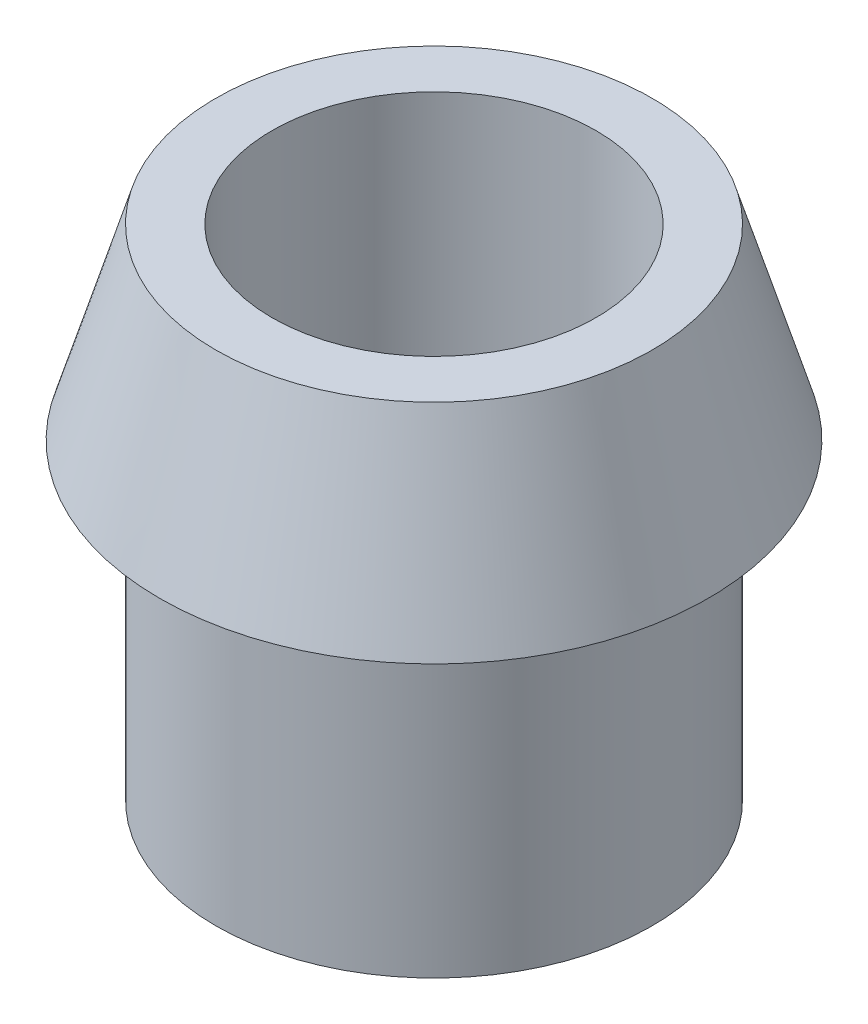
ISO-10303-21;
HEADER;
FILE_DESCRIPTION(('STEP AP214'),'2;1');
FILE_NAME('part.step','',(''),(''),'','','');
FILE_SCHEMA(('AUTOMOTIVE_DESIGN { 1 0 10303 214 1 1 1 1 }'));
ENDSEC;
DATA;
#1=APPLICATION_CONTEXT('core data for automotive mechanical design processes');
#2=APPLICATION_PROTOCOL_DEFINITION('international standard','automotive_design',2000,#1);
#3=PRODUCT_CONTEXT('',#1,'mechanical');
#4=PRODUCT('Part','Part','',(#3));
#5=PRODUCT_RELATED_PRODUCT_CATEGORY('part','',(#4));
#6=PRODUCT_DEFINITION_FORMATION('','',#4);
#7=PRODUCT_DEFINITION_CONTEXT('part definition',#1,'design');
#8=PRODUCT_DEFINITION('design','',#6,#7);
#9=PRODUCT_DEFINITION_SHAPE('','',#8);
#10=(LENGTH_UNIT() NAMED_UNIT(*) SI_UNIT(.MILLI.,.METRE.));
#11=(NAMED_UNIT(*) PLANE_ANGLE_UNIT() SI_UNIT($,.RADIAN.));
#12=(NAMED_UNIT(*) SI_UNIT($,.STERADIAN.) SOLID_ANGLE_UNIT());
#13=UNCERTAINTY_MEASURE_WITH_UNIT(LENGTH_MEASURE(1.E-05),#10,'distance_accuracy_value','');
#14=(GEOMETRIC_REPRESENTATION_CONTEXT(3) GLOBAL_UNCERTAINTY_ASSIGNED_CONTEXT((#13)) GLOBAL_UNIT_ASSIGNED_CONTEXT((#10,
#11,#12)) REPRESENTATION_CONTEXT('',''));
#15=CARTESIAN_POINT('',(0.,0.,0.));
#16=DIRECTION('',(0.,0.,1.));
#17=DIRECTION('',(1.,0.,0.));
#18=AXIS2_PLACEMENT_3D('',#15,#16,#17);
#19=CARTESIAN_POINT('',(0.,5.,0.));
#20=DIRECTION('',(0.,-1.,0.));
#21=DIRECTION('',(0.,0.,-1.));
#22=AXIS2_PLACEMENT_3D('',#19,#20,#21);
#23=CYLINDRICAL_SURFACE('',#22,3.5);
#24=CARTESIAN_POINT('',(0.,5.,0.));
#25=DIRECTION('',(0.,1.,0.));
#26=DIRECTION('',(0.,0.,1.));
#27=AXIS2_PLACEMENT_3D('',#24,#25,#26);
#28=CIRCLE('',#27,3.5);
#29=CARTESIAN_POINT('',(0.,5.,3.5));
#30=VERTEX_POINT('',#29);
#31=EDGE_CURVE('E42',#30,#30,#28,.T.);
#32=ORIENTED_EDGE('',*,*,#31,.F.);
#33=EDGE_LOOP('',(#32));
#34=FACE_BOUND('',#33,.T.);
#35=CARTESIAN_POINT('',(0.,0.,0.));
#36=DIRECTION('',(0.,1.,0.));
#37=DIRECTION('',(0.,0.,1.));
#38=AXIS2_PLACEMENT_3D('',#35,#36,#37);
#39=CIRCLE('',#38,3.5);
#40=CARTESIAN_POINT('',(0.,0.,3.5));
#41=VERTEX_POINT('',#40);
#42=EDGE_CURVE('E46',#41,#41,#39,.T.);
#43=ORIENTED_EDGE('',*,*,#42,.T.);
#44=EDGE_LOOP('',(#43));
#45=FACE_BOUND('',#44,.T.);
#46=ADVANCED_FACE('F31',(#34,#45),#23,.T.);
#47=CARTESIAN_POINT('',(0.,0.,0.));
#48=DIRECTION('',(0.,1.,0.));
#49=DIRECTION('',(0.,0.,1.));
#50=AXIS2_PLACEMENT_3D('',#47,#48,#49);
#51=PLANE('',#50);
#52=CARTESIAN_POINT('',(0.,0.,0.));
#53=DIRECTION('',(0.,1.,0.));
#54=DIRECTION('',(0.,0.,1.));
#55=AXIS2_PLACEMENT_3D('',#52,#53,#54);
#56=CIRCLE('',#55,2.6);
#57=CARTESIAN_POINT('',(0.,0.,2.6));
#58=VERTEX_POINT('',#57);
#59=EDGE_CURVE('E50',#58,#58,#56,.T.);
#60=ORIENTED_EDGE('',*,*,#59,.T.);
#61=EDGE_LOOP('',(#60));
#62=FACE_BOUND('',#61,.T.);
#63=ORIENTED_EDGE('',*,*,#42,.F.);
#64=EDGE_LOOP('',(#63));
#65=FACE_BOUND('',#64,.T.);
#66=ADVANCED_FACE('F64',(#62,#65),#51,.F.);
#67=CARTESIAN_POINT('',(0.,8.,0.));
#68=DIRECTION('',(0.,1.,0.));
#69=DIRECTION('',(0.,0.,1.));
#70=AXIS2_PLACEMENT_3D('',#67,#68,#69);
#71=PLANE('',#70);
#72=CARTESIAN_POINT('',(0.,8.,0.));
#73=DIRECTION('',(0.,1.,0.));
#74=DIRECTION('',(0.,0.,1.));
#75=AXIS2_PLACEMENT_3D('',#72,#73,#74);
#76=CIRCLE('',#75,2.6);
#77=CARTESIAN_POINT('',(0.,8.,2.6));
#78=VERTEX_POINT('',#77);
#79=EDGE_CURVE('E54',#78,#78,#76,.T.);
#80=ORIENTED_EDGE('',*,*,#79,.F.);
#81=EDGE_LOOP('',(#80));
#82=FACE_BOUND('',#81,.T.);
#83=CARTESIAN_POINT('',(0.,8.,0.));
#84=DIRECTION('',(0.,1.,0.));
#85=DIRECTION('',(0.,0.,1.));
#86=AXIS2_PLACEMENT_3D('',#83,#84,#85);
#87=CIRCLE('',#86,3.5);
#88=CARTESIAN_POINT('',(0.,8.,3.5));
#89=VERTEX_POINT('',#88);
#90=EDGE_CURVE('E38',#89,#89,#87,.T.);
#91=ORIENTED_EDGE('',*,*,#90,.T.);
#92=EDGE_LOOP('',(#91));
#93=FACE_BOUND('',#92,.T.);
#94=ADVANCED_FACE('F61',(#82,#93),#71,.T.);
#95=CARTESIAN_POINT('',(0.,5.,0.));
#96=DIRECTION('',(0.,1.,0.));
#97=DIRECTION('',(0.,0.,1.));
#98=AXIS2_PLACEMENT_3D('',#95,#96,#97);
#99=PLANE('',#98);
#100=CARTESIAN_POINT('',(0.,5.,0.));
#101=DIRECTION('',(0.,1.,0.));
#102=DIRECTION('',(0.,0.,1.));
#103=AXIS2_PLACEMENT_3D('',#100,#101,#102);
#104=CIRCLE('',#103,4.4);
#105=CARTESIAN_POINT('',(0.,5.,4.4));
#106=VERTEX_POINT('',#105);
#107=EDGE_CURVE('E10',#106,#106,#104,.F.);
#108=ORIENTED_EDGE('',*,*,#107,.T.);
#109=EDGE_LOOP('',(#108));
#110=FACE_BOUND('',#109,.T.);
#111=ORIENTED_EDGE('',*,*,#31,.T.);
#112=EDGE_LOOP('',(#111));
#113=FACE_BOUND('',#112,.T.);
#114=ADVANCED_FACE('F63',(#110,#113),#99,.F.);
#115=CARTESIAN_POINT('',(0.,8.,0.));
#116=DIRECTION('',(0.,-1.,0.));
#117=DIRECTION('',(0.,0.,-1.));
#118=AXIS2_PLACEMENT_3D('',#115,#116,#117);
#119=CONICAL_SURFACE('',#118,3.5,0.291456794477867);
#120=ORIENTED_EDGE('',*,*,#107,.F.);
#121=EDGE_LOOP('',(#120));
#122=FACE_BOUND('',#121,.T.);
#123=ORIENTED_EDGE('',*,*,#90,.F.);
#124=EDGE_LOOP('',(#123));
#125=FACE_BOUND('',#124,.T.);
#126=ADVANCED_FACE('F33',(#122,#125),#119,.T.);
#127=CARTESIAN_POINT('',(0.,-12.,0.));
#128=DIRECTION('',(0.,1.,0.));
#129=DIRECTION('',(0.,0.,1.));
#130=AXIS2_PLACEMENT_3D('',#127,#128,#129);
#131=CYLINDRICAL_SURFACE('',#130,2.6);
#132=ORIENTED_EDGE('',*,*,#79,.T.);
#133=EDGE_LOOP('',(#132));
#134=FACE_BOUND('',#133,.T.);
#135=ORIENTED_EDGE('',*,*,#59,.F.);
#136=EDGE_LOOP('',(#135));
#137=FACE_BOUND('',#136,.T.);
#138=ADVANCED_FACE('F58',(#134,#137),#131,.F.);
#139=CLOSED_SHELL('',(#46,#66,#94,#114,#126,#138));
#140=MANIFOLD_SOLID_BREP('B2',#139);
#141=ADVANCED_BREP_SHAPE_REPRESENTATION('',(#18,#140),#14);
#142=SHAPE_DEFINITION_REPRESENTATION(#9,#141);
ENDSEC;
END-ISO-10303-21;
